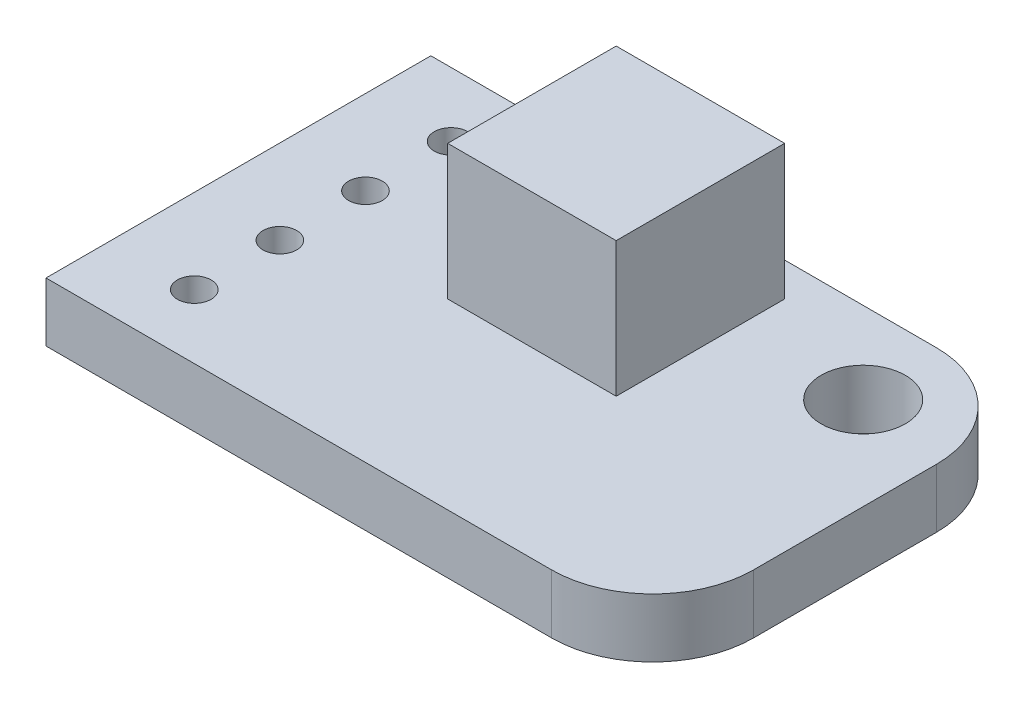
ISO-10303-21;
HEADER;
FILE_DESCRIPTION(('STEP AP214'),'2;1');
FILE_NAME('part.step','',(''),(''),'','','');
FILE_SCHEMA(('AUTOMOTIVE_DESIGN { 1 0 10303 214 1 1 1 1 }'));
ENDSEC;
DATA;
#1=APPLICATION_CONTEXT('core data for automotive mechanical design processes');
#2=APPLICATION_PROTOCOL_DEFINITION('international standard','automotive_design',2000,#1);
#3=PRODUCT_CONTEXT('',#1,'mechanical');
#4=PRODUCT('Part','Part','',(#3));
#5=PRODUCT_RELATED_PRODUCT_CATEGORY('part','',(#4));
#6=PRODUCT_DEFINITION_FORMATION('','',#4);
#7=PRODUCT_DEFINITION_CONTEXT('part definition',#1,'design');
#8=PRODUCT_DEFINITION('design','',#6,#7);
#9=PRODUCT_DEFINITION_SHAPE('','',#8);
#10=(LENGTH_UNIT() NAMED_UNIT(*) SI_UNIT(.MILLI.,.METRE.));
#11=(NAMED_UNIT(*) PLANE_ANGLE_UNIT() SI_UNIT($,.RADIAN.));
#12=(NAMED_UNIT(*) SI_UNIT($,.STERADIAN.) SOLID_ANGLE_UNIT());
#13=UNCERTAINTY_MEASURE_WITH_UNIT(LENGTH_MEASURE(1.E-05),#10,'distance_accuracy_value','');
#14=(GEOMETRIC_REPRESENTATION_CONTEXT(3) GLOBAL_UNCERTAINTY_ASSIGNED_CONTEXT((#13)) GLOBAL_UNIT_ASSIGNED_CONTEXT((#10,
#11,#12)) REPRESENTATION_CONTEXT('',''));
#15=CARTESIAN_POINT('',(0.,0.,0.));
#16=DIRECTION('',(0.,0.,1.));
#17=DIRECTION('',(1.,0.,0.));
#18=AXIS2_PLACEMENT_3D('',#15,#16,#17);
#19=CARTESIAN_POINT('',(7.50000000000001,0.875,2.71));
#20=DIRECTION('',(0.,-1.,0.));
#21=DIRECTION('',(0.,0.,-1.));
#22=AXIS2_PLACEMENT_3D('',#19,#20,#21);
#23=PLANE('',#22);
#24=CARTESIAN_POINT('',(-4.99999999999999,0.875,3.81));
#25=DIRECTION('',(0.,1.,0.));
#26=DIRECTION('',(0.,0.,1.));
#27=AXIS2_PLACEMENT_3D('',#24,#25,#26);
#28=CIRCLE('',#27,0.500000000000001);
#29=CARTESIAN_POINT('',(-4.99999999999999,0.875,4.31));
#30=VERTEX_POINT('',#29);
#31=EDGE_CURVE('E142',#30,#30,#28,.T.);
#32=ORIENTED_EDGE('',*,*,#31,.F.);
#33=EDGE_LOOP('',(#32));
#34=FACE_BOUND('',#33,.T.);
#35=CARTESIAN_POINT('',(-4.99999999999999,0.875,1.27));
#36=DIRECTION('',(0.,1.,0.));
#37=DIRECTION('',(0.,0.,1.));
#38=AXIS2_PLACEMENT_3D('',#35,#36,#37);
#39=CIRCLE('',#38,0.500000000000001);
#40=CARTESIAN_POINT('',(-4.99999999999999,0.875,1.77));
#41=VERTEX_POINT('',#40);
#42=EDGE_CURVE('E151',#41,#41,#39,.T.);
#43=ORIENTED_EDGE('',*,*,#42,.F.);
#44=EDGE_LOOP('',(#43));
#45=FACE_BOUND('',#44,.T.);
#46=CARTESIAN_POINT('',(-4.99999999999999,0.875,-1.27));
#47=DIRECTION('',(0.,1.,0.));
#48=DIRECTION('',(0.,0.,1.));
#49=AXIS2_PLACEMENT_3D('',#46,#47,#48);
#50=CIRCLE('',#49,0.500000000000001);
#51=CARTESIAN_POINT('',(-4.99999999999999,0.875,-0.769999999999999));
#52=VERTEX_POINT('',#51);
#53=EDGE_CURVE('E157',#52,#52,#50,.T.);
#54=ORIENTED_EDGE('',*,*,#53,.F.);
#55=EDGE_LOOP('',(#54));
#56=FACE_BOUND('',#55,.T.);
#57=CARTESIAN_POINT('',(-4.99999999999999,0.875,-3.81));
#58=DIRECTION('',(0.,1.,0.));
#59=DIRECTION('',(0.,0.,1.));
#60=AXIS2_PLACEMENT_3D('',#57,#58,#59);
#61=CIRCLE('',#60,0.500000000000001);
#62=CARTESIAN_POINT('',(-4.99999999999999,0.875,-3.31));
#63=VERTEX_POINT('',#62);
#64=EDGE_CURVE('E163',#63,#63,#61,.T.);
#65=ORIENTED_EDGE('',*,*,#64,.F.);
#66=EDGE_LOOP('',(#65));
#67=FACE_BOUND('',#66,.T.);
#68=CARTESIAN_POINT('',(7.75000000000001,0.875,-3.29));
#69=DIRECTION('',(0.,1.,0.));
#70=DIRECTION('',(0.,0.,1.));
#71=AXIS2_PLACEMENT_3D('',#68,#69,#70);
#72=CIRCLE('',#71,1.25);
#73=CARTESIAN_POINT('',(7.75000000000001,0.875,-2.04));
#74=VERTEX_POINT('',#73);
#75=EDGE_CURVE('E169',#74,#74,#72,.T.);
#76=ORIENTED_EDGE('',*,*,#75,.F.);
#77=EDGE_LOOP('',(#76));
#78=FACE_BOUND('',#77,.T.);
#79=DIRECTION('',(0.,0.,1.));
#80=VECTOR('',#79,1.);
#81=CARTESIAN_POINT('',(-7.49999999999999,0.875,-5.71));
#82=LINE('',#81,#80);
#83=CARTESIAN_POINT('',(-7.49999999999999,0.875,-5.71));
#84=VERTEX_POINT('',#83);
#85=CARTESIAN_POINT('',(-7.49999999999999,0.875,5.71));
#86=VERTEX_POINT('',#85);
#87=EDGE_CURVE('E175',#84,#86,#82,.T.);
#88=ORIENTED_EDGE('',*,*,#87,.T.);
#89=DIRECTION('',(1.,0.,0.));
#90=VECTOR('',#89,1.);
#91=CARTESIAN_POINT('',(-7.49999999999999,0.875,5.71));
#92=LINE('',#91,#90);
#93=CARTESIAN_POINT('',(7.49999999999999,0.875,5.71));
#94=VERTEX_POINT('',#93);
#95=EDGE_CURVE('E178',#86,#94,#92,.T.);
#96=ORIENTED_EDGE('',*,*,#95,.T.);
#97=CARTESIAN_POINT('',(7.50000000000001,0.875,2.71));
#98=DIRECTION('',(0.,1.,0.));
#99=DIRECTION('',(0.,0.,-1.));
#100=AXIS2_PLACEMENT_3D('',#97,#98,#99);
#101=CIRCLE('',#100,3.);
#102=CARTESIAN_POINT('',(10.5,0.875,2.71));
#103=VERTEX_POINT('',#102);
#104=EDGE_CURVE('E181',#94,#103,#101,.T.);
#105=ORIENTED_EDGE('',*,*,#104,.T.);
#106=DIRECTION('',(0.,0.,-1.));
#107=VECTOR('',#106,1.);
#108=CARTESIAN_POINT('',(10.5,0.875,-2.71));
#109=LINE('',#108,#107);
#110=CARTESIAN_POINT('',(10.5,0.875,-2.71));
#111=VERTEX_POINT('',#110);
#112=EDGE_CURVE('E183',#103,#111,#109,.T.);
#113=ORIENTED_EDGE('',*,*,#112,.T.);
#114=CARTESIAN_POINT('',(7.50000000000001,0.875,-2.71));
#115=DIRECTION('',(0.,1.,0.));
#116=DIRECTION('',(0.,0.,-1.));
#117=AXIS2_PLACEMENT_3D('',#114,#115,#116);
#118=CIRCLE('',#117,3.);
#119=CARTESIAN_POINT('',(7.49999999999999,0.875,-5.71));
#120=VERTEX_POINT('',#119);
#121=EDGE_CURVE('E185',#111,#120,#118,.T.);
#122=ORIENTED_EDGE('',*,*,#121,.T.);
#123=DIRECTION('',(-1.,0.,0.));
#124=VECTOR('',#123,1.);
#125=CARTESIAN_POINT('',(-7.49999999999999,0.875,-5.71));
#126=LINE('',#125,#124);
#127=EDGE_CURVE('E187',#120,#84,#126,.T.);
#128=ORIENTED_EDGE('',*,*,#127,.T.);
#129=EDGE_LOOP('',(#88,#96,#105,#113,#122,#128));
#130=FACE_BOUND('',#129,.T.);
#131=DIRECTION('',(0.,0.,1.));
#132=VECTOR('',#131,1.);
#133=CARTESIAN_POINT('',(-0.999999999999989,0.875,-4.71));
#134=LINE('',#133,#132);
#135=CARTESIAN_POINT('',(-0.999999999999989,0.875,-4.71));
#136=VERTEX_POINT('',#135);
#137=CARTESIAN_POINT('',(-0.999999999999988,0.875,0.290000000000001));
#138=VERTEX_POINT('',#137);
#139=EDGE_CURVE('E138',#136,#138,#134,.T.);
#140=ORIENTED_EDGE('',*,*,#139,.F.);
#141=DIRECTION('',(-1.,0.,0.));
#142=VECTOR('',#141,1.);
#143=CARTESIAN_POINT('',(-0.999999999999989,0.875,-4.71));
#144=LINE('',#143,#142);
#145=CARTESIAN_POINT('',(4.00000000000001,0.875,-4.71));
#146=VERTEX_POINT('',#145);
#147=EDGE_CURVE('E135',#146,#136,#144,.T.);
#148=ORIENTED_EDGE('',*,*,#147,.F.);
#149=DIRECTION('',(0.,0.,-1.));
#150=VECTOR('',#149,1.);
#151=CARTESIAN_POINT('',(4.00000000000001,0.875,-4.71));
#152=LINE('',#151,#150);
#153=CARTESIAN_POINT('',(4.00000000000001,0.875,0.29));
#154=VERTEX_POINT('',#153);
#155=EDGE_CURVE('E61',#154,#146,#152,.T.);
#156=ORIENTED_EDGE('',*,*,#155,.F.);
#157=DIRECTION('',(1.,0.,0.));
#158=VECTOR('',#157,1.);
#159=CARTESIAN_POINT('',(-0.999999999999989,0.875,0.290000000000001));
#160=LINE('',#159,#158);
#161=EDGE_CURVE('E56',#138,#154,#160,.T.);
#162=ORIENTED_EDGE('',*,*,#161,.F.);
#163=EDGE_LOOP('',(#140,#148,#156,#162));
#164=FACE_BOUND('',#163,.T.);
#165=ADVANCED_FACE('F41',(#34,#45,#56,#67,#78,#130,#164),#23,.F.);
#166=CARTESIAN_POINT('',(7.50000000000001,-0.875,2.71));
#167=DIRECTION('',(0.,-1.,0.));
#168=DIRECTION('',(0.,0.,-1.));
#169=AXIS2_PLACEMENT_3D('',#166,#167,#168);
#170=PLANE('',#169);
#171=CARTESIAN_POINT('',(-4.99999999999999,-0.875,1.27));
#172=DIRECTION('',(0.,1.,0.));
#173=DIRECTION('',(0.,0.,1.));
#174=AXIS2_PLACEMENT_3D('',#171,#172,#173);
#175=CIRCLE('',#174,0.500000000000001);
#176=CARTESIAN_POINT('',(-4.99999999999999,-0.875,1.77));
#177=VERTEX_POINT('',#176);
#178=EDGE_CURVE('E149',#177,#177,#175,.T.);
#179=ORIENTED_EDGE('',*,*,#178,.T.);
#180=EDGE_LOOP('',(#179));
#181=FACE_BOUND('',#180,.T.);
#182=CARTESIAN_POINT('',(-4.99999999999999,-0.875,-3.81));
#183=DIRECTION('',(0.,1.,0.));
#184=DIRECTION('',(0.,0.,1.));
#185=AXIS2_PLACEMENT_3D('',#182,#183,#184);
#186=CIRCLE('',#185,0.500000000000001);
#187=CARTESIAN_POINT('',(-4.99999999999999,-0.875,-3.31));
#188=VERTEX_POINT('',#187);
#189=EDGE_CURVE('E160',#188,#188,#186,.T.);
#190=ORIENTED_EDGE('',*,*,#189,.T.);
#191=EDGE_LOOP('',(#190));
#192=FACE_BOUND('',#191,.T.);
#193=DIRECTION('',(0.,0.,1.));
#194=VECTOR('',#193,1.);
#195=CARTESIAN_POINT('',(-7.49999999999999,-0.875,-5.71));
#196=LINE('',#195,#194);
#197=CARTESIAN_POINT('',(-7.49999999999999,-0.875,-5.71));
#198=VERTEX_POINT('',#197);
#199=CARTESIAN_POINT('',(-7.49999999999999,-0.875,5.71));
#200=VERTEX_POINT('',#199);
#201=EDGE_CURVE('E172',#198,#200,#196,.T.);
#202=ORIENTED_EDGE('',*,*,#201,.F.);
#203=DIRECTION('',(-1.,0.,0.));
#204=VECTOR('',#203,1.);
#205=CARTESIAN_POINT('',(-7.49999999999999,-0.875,-5.71));
#206=LINE('',#205,#204);
#207=CARTESIAN_POINT('',(7.49999999999999,-0.875,-5.71));
#208=VERTEX_POINT('',#207);
#209=EDGE_CURVE('E179',#208,#198,#206,.T.);
#210=ORIENTED_EDGE('',*,*,#209,.F.);
#211=CARTESIAN_POINT('',(7.50000000000001,-0.875,-2.71));
#212=DIRECTION('',(0.,1.,0.));
#213=DIRECTION('',(0.,0.,-1.));
#214=AXIS2_PLACEMENT_3D('',#211,#212,#213);
#215=CIRCLE('',#214,3.);
#216=CARTESIAN_POINT('',(10.5,-0.875,-2.71));
#217=VERTEX_POINT('',#216);
#218=EDGE_CURVE('E198',#217,#208,#215,.T.);
#219=ORIENTED_EDGE('',*,*,#218,.F.);
#220=DIRECTION('',(0.,0.,-1.));
#221=VECTOR('',#220,1.);
#222=CARTESIAN_POINT('',(10.5,-0.875,-2.71));
#223=LINE('',#222,#221);
#224=CARTESIAN_POINT('',(10.5,-0.875,2.71));
#225=VERTEX_POINT('',#224);
#226=EDGE_CURVE('E196',#225,#217,#223,.T.);
#227=ORIENTED_EDGE('',*,*,#226,.F.);
#228=CARTESIAN_POINT('',(7.50000000000001,-0.875,2.71));
#229=DIRECTION('',(0.,1.,0.));
#230=DIRECTION('',(0.,0.,-1.));
#231=AXIS2_PLACEMENT_3D('',#228,#229,#230);
#232=CIRCLE('',#231,3.);
#233=CARTESIAN_POINT('',(7.49999999999999,-0.875,5.71));
#234=VERTEX_POINT('',#233);
#235=EDGE_CURVE('E194',#234,#225,#232,.T.);
#236=ORIENTED_EDGE('',*,*,#235,.F.);
#237=DIRECTION('',(1.,0.,0.));
#238=VECTOR('',#237,1.);
#239=CARTESIAN_POINT('',(-7.49999999999999,-0.875,5.71));
#240=LINE('',#239,#238);
#241=EDGE_CURVE('E192',#200,#234,#240,.T.);
#242=ORIENTED_EDGE('',*,*,#241,.F.);
#243=EDGE_LOOP('',(#202,#210,#219,#227,#236,#242));
#244=FACE_BOUND('',#243,.T.);
#245=CARTESIAN_POINT('',(7.75000000000001,-0.875,-3.29));
#246=DIRECTION('',(0.,1.,0.));
#247=DIRECTION('',(0.,0.,1.));
#248=AXIS2_PLACEMENT_3D('',#245,#246,#247);
#249=CIRCLE('',#248,1.25);
#250=CARTESIAN_POINT('',(7.75000000000001,-0.875,-2.04));
#251=VERTEX_POINT('',#250);
#252=EDGE_CURVE('E166',#251,#251,#249,.T.);
#253=ORIENTED_EDGE('',*,*,#252,.T.);
#254=EDGE_LOOP('',(#253));
#255=FACE_BOUND('',#254,.T.);
#256=CARTESIAN_POINT('',(-4.99999999999999,-0.875,-1.27));
#257=DIRECTION('',(0.,1.,0.));
#258=DIRECTION('',(0.,0.,1.));
#259=AXIS2_PLACEMENT_3D('',#256,#257,#258);
#260=CIRCLE('',#259,0.500000000000001);
#261=CARTESIAN_POINT('',(-4.99999999999999,-0.875,-0.769999999999999));
#262=VERTEX_POINT('',#261);
#263=EDGE_CURVE('E154',#262,#262,#260,.T.);
#264=ORIENTED_EDGE('',*,*,#263,.T.);
#265=EDGE_LOOP('',(#264));
#266=FACE_BOUND('',#265,.T.);
#267=CARTESIAN_POINT('',(-4.99999999999999,-0.875,3.81));
#268=DIRECTION('',(0.,1.,0.));
#269=DIRECTION('',(0.,0.,1.));
#270=AXIS2_PLACEMENT_3D('',#267,#268,#269);
#271=CIRCLE('',#270,0.500000000000001);
#272=CARTESIAN_POINT('',(-4.99999999999999,-0.875,4.31));
#273=VERTEX_POINT('',#272);
#274=EDGE_CURVE('E139',#273,#273,#271,.T.);
#275=ORIENTED_EDGE('',*,*,#274,.T.);
#276=EDGE_LOOP('',(#275));
#277=FACE_BOUND('',#276,.T.);
#278=ADVANCED_FACE('F222',(#181,#192,#244,#255,#266,#277),#170,.T.);
#279=CARTESIAN_POINT('',(-7.49999999999999,0.875,-5.71));
#280=DIRECTION('',(1.,0.,0.));
#281=DIRECTION('',(0.,0.,-1.));
#282=AXIS2_PLACEMENT_3D('',#279,#280,#281);
#283=PLANE('',#282);
#284=ORIENTED_EDGE('',*,*,#201,.T.);
#285=DIRECTION('',(0.,-1.,0.));
#286=VECTOR('',#285,1.);
#287=CARTESIAN_POINT('',(-7.49999999999999,0.875,5.71));
#288=LINE('',#287,#286);
#289=EDGE_CURVE('E11',#86,#200,#288,.T.);
#290=ORIENTED_EDGE('',*,*,#289,.F.);
#291=ORIENTED_EDGE('',*,*,#87,.F.);
#292=DIRECTION('',(0.,-1.,0.));
#293=VECTOR('',#292,1.);
#294=CARTESIAN_POINT('',(-7.49999999999999,0.875,-5.71));
#295=LINE('',#294,#293);
#296=EDGE_CURVE('E189',#84,#198,#295,.T.);
#297=ORIENTED_EDGE('',*,*,#296,.T.);
#298=EDGE_LOOP('',(#284,#290,#291,#297));
#299=FACE_BOUND('',#298,.T.);
#300=ADVANCED_FACE('F43',(#299),#283,.F.);
#301=CARTESIAN_POINT('',(-7.49999999999999,0.875,5.71));
#302=DIRECTION('',(0.,0.,-1.));
#303=DIRECTION('',(-1.,0.,0.));
#304=AXIS2_PLACEMENT_3D('',#301,#302,#303);
#305=PLANE('',#304);
#306=ORIENTED_EDGE('',*,*,#241,.T.);
#307=DIRECTION('',(0.,-1.,0.));
#308=VECTOR('',#307,1.);
#309=CARTESIAN_POINT('',(7.49999999999999,0.875,5.71));
#310=LINE('',#309,#308);
#311=EDGE_CURVE('E49',#94,#234,#310,.T.);
#312=ORIENTED_EDGE('',*,*,#311,.F.);
#313=ORIENTED_EDGE('',*,*,#95,.F.);
#314=ORIENTED_EDGE('',*,*,#289,.T.);
#315=EDGE_LOOP('',(#306,#312,#313,#314));
#316=FACE_BOUND('',#315,.T.);
#317=ADVANCED_FACE('F239',(#316),#305,.F.);
#318=CARTESIAN_POINT('',(7.50000000000001,0.875,2.71));
#319=DIRECTION('',(0.,-1.,0.));
#320=DIRECTION('',(0.,0.,-1.));
#321=AXIS2_PLACEMENT_3D('',#318,#319,#320);
#322=CYLINDRICAL_SURFACE('',#321,3.);
#323=ORIENTED_EDGE('',*,*,#235,.T.);
#324=DIRECTION('',(0.,-1.,0.));
#325=VECTOR('',#324,1.);
#326=CARTESIAN_POINT('',(10.5,0.875,2.71));
#327=LINE('',#326,#325);
#328=EDGE_CURVE('E209',#103,#225,#327,.T.);
#329=ORIENTED_EDGE('',*,*,#328,.F.);
#330=ORIENTED_EDGE('',*,*,#104,.F.);
#331=ORIENTED_EDGE('',*,*,#311,.T.);
#332=EDGE_LOOP('',(#323,#329,#330,#331));
#333=FACE_BOUND('',#332,.T.);
#334=ADVANCED_FACE('F216',(#333),#322,.T.);
#335=CARTESIAN_POINT('',(10.5,0.875,-2.71));
#336=DIRECTION('',(-1.,0.,0.));
#337=DIRECTION('',(0.,0.,1.));
#338=AXIS2_PLACEMENT_3D('',#335,#336,#337);
#339=PLANE('',#338);
#340=ORIENTED_EDGE('',*,*,#226,.T.);
#341=DIRECTION('',(0.,-1.,0.));
#342=VECTOR('',#341,1.);
#343=CARTESIAN_POINT('',(10.5,0.875,-2.71));
#344=LINE('',#343,#342);
#345=EDGE_CURVE('E206',#111,#217,#344,.T.);
#346=ORIENTED_EDGE('',*,*,#345,.F.);
#347=ORIENTED_EDGE('',*,*,#112,.F.);
#348=ORIENTED_EDGE('',*,*,#328,.T.);
#349=EDGE_LOOP('',(#340,#346,#347,#348));
#350=FACE_BOUND('',#349,.T.);
#351=ADVANCED_FACE('F228',(#350),#339,.F.);
#352=CARTESIAN_POINT('',(7.50000000000001,0.875,-2.71));
#353=DIRECTION('',(0.,-1.,0.));
#354=DIRECTION('',(0.,0.,-1.));
#355=AXIS2_PLACEMENT_3D('',#352,#353,#354);
#356=CYLINDRICAL_SURFACE('',#355,3.);
#357=ORIENTED_EDGE('',*,*,#218,.T.);
#358=DIRECTION('',(0.,-1.,0.));
#359=VECTOR('',#358,1.);
#360=CARTESIAN_POINT('',(7.49999999999999,0.875,-5.71));
#361=LINE('',#360,#359);
#362=EDGE_CURVE('E203',#120,#208,#361,.T.);
#363=ORIENTED_EDGE('',*,*,#362,.F.);
#364=ORIENTED_EDGE('',*,*,#121,.F.);
#365=ORIENTED_EDGE('',*,*,#345,.T.);
#366=EDGE_LOOP('',(#357,#363,#364,#365));
#367=FACE_BOUND('',#366,.T.);
#368=ADVANCED_FACE('F232',(#367),#356,.T.);
#369=CARTESIAN_POINT('',(-7.49999999999999,0.875,-5.71));
#370=DIRECTION('',(0.,0.,1.));
#371=DIRECTION('',(1.,0.,0.));
#372=AXIS2_PLACEMENT_3D('',#369,#370,#371);
#373=PLANE('',#372);
#374=ORIENTED_EDGE('',*,*,#209,.T.);
#375=ORIENTED_EDGE('',*,*,#296,.F.);
#376=ORIENTED_EDGE('',*,*,#127,.F.);
#377=ORIENTED_EDGE('',*,*,#362,.T.);
#378=EDGE_LOOP('',(#374,#375,#376,#377));
#379=FACE_BOUND('',#378,.T.);
#380=ADVANCED_FACE('F242',(#379),#373,.F.);
#381=CARTESIAN_POINT('',(7.75000000000001,0.875,-3.29));
#382=DIRECTION('',(0.,-1.,0.));
#383=DIRECTION('',(0.,0.,-1.));
#384=AXIS2_PLACEMENT_3D('',#381,#382,#383);
#385=CYLINDRICAL_SURFACE('',#384,1.25);
#386=ORIENTED_EDGE('',*,*,#75,.T.);
#387=EDGE_LOOP('',(#386));
#388=FACE_BOUND('',#387,.T.);
#389=ORIENTED_EDGE('',*,*,#252,.F.);
#390=EDGE_LOOP('',(#389));
#391=FACE_BOUND('',#390,.T.);
#392=ADVANCED_FACE('F244',(#388,#391),#385,.F.);
#393=CARTESIAN_POINT('',(-4.99999999999999,0.875,-3.81));
#394=DIRECTION('',(0.,-1.,0.));
#395=DIRECTION('',(0.,0.,-1.));
#396=AXIS2_PLACEMENT_3D('',#393,#394,#395);
#397=CYLINDRICAL_SURFACE('',#396,0.500000000000001);
#398=ORIENTED_EDGE('',*,*,#64,.T.);
#399=EDGE_LOOP('',(#398));
#400=FACE_BOUND('',#399,.T.);
#401=ORIENTED_EDGE('',*,*,#189,.F.);
#402=EDGE_LOOP('',(#401));
#403=FACE_BOUND('',#402,.T.);
#404=ADVANCED_FACE('F250',(#400,#403),#397,.F.);
#405=CARTESIAN_POINT('',(-4.99999999999999,0.875,-1.27));
#406=DIRECTION('',(0.,-1.,0.));
#407=DIRECTION('',(0.,0.,-1.));
#408=AXIS2_PLACEMENT_3D('',#405,#406,#407);
#409=CYLINDRICAL_SURFACE('',#408,0.500000000000001);
#410=ORIENTED_EDGE('',*,*,#53,.T.);
#411=EDGE_LOOP('',(#410));
#412=FACE_BOUND('',#411,.T.);
#413=ORIENTED_EDGE('',*,*,#263,.F.);
#414=EDGE_LOOP('',(#413));
#415=FACE_BOUND('',#414,.T.);
#416=ADVANCED_FACE('F267',(#412,#415),#409,.F.);
#417=CARTESIAN_POINT('',(-4.99999999999999,0.875,1.27));
#418=DIRECTION('',(0.,-1.,0.));
#419=DIRECTION('',(0.,0.,-1.));
#420=AXIS2_PLACEMENT_3D('',#417,#418,#419);
#421=CYLINDRICAL_SURFACE('',#420,0.500000000000001);
#422=ORIENTED_EDGE('',*,*,#42,.T.);
#423=EDGE_LOOP('',(#422));
#424=FACE_BOUND('',#423,.T.);
#425=ORIENTED_EDGE('',*,*,#178,.F.);
#426=EDGE_LOOP('',(#425));
#427=FACE_BOUND('',#426,.T.);
#428=ADVANCED_FACE('F271',(#424,#427),#421,.F.);
#429=CARTESIAN_POINT('',(-4.99999999999999,0.875,3.81));
#430=DIRECTION('',(0.,-1.,0.));
#431=DIRECTION('',(0.,0.,-1.));
#432=AXIS2_PLACEMENT_3D('',#429,#430,#431);
#433=CYLINDRICAL_SURFACE('',#432,0.500000000000001);
#434=ORIENTED_EDGE('',*,*,#31,.T.);
#435=EDGE_LOOP('',(#434));
#436=FACE_BOUND('',#435,.T.);
#437=ORIENTED_EDGE('',*,*,#274,.F.);
#438=EDGE_LOOP('',(#437));
#439=FACE_BOUND('',#438,.T.);
#440=ADVANCED_FACE('F275',(#436,#439),#433,.F.);
#441=CARTESIAN_POINT('',(-0.999999999999989,4.875,-4.71));
#442=DIRECTION('',(1.,0.,0.));
#443=DIRECTION('',(0.,0.,-1.));
#444=AXIS2_PLACEMENT_3D('',#441,#442,#443);
#445=PLANE('',#444);
#446=ORIENTED_EDGE('',*,*,#139,.T.);
#447=DIRECTION('',(0.,-1.,0.));
#448=VECTOR('',#447,1.);
#449=CARTESIAN_POINT('',(-0.999999999999989,4.875,0.290000000000001));
#450=LINE('',#449,#448);
#451=CARTESIAN_POINT('',(-0.999999999999989,4.875,0.290000000000001));
#452=VERTEX_POINT('',#451);
#453=EDGE_CURVE('E119',#452,#138,#450,.T.);
#454=ORIENTED_EDGE('',*,*,#453,.F.);
#455=DIRECTION('',(0.,0.,1.));
#456=VECTOR('',#455,1.);
#457=CARTESIAN_POINT('',(-0.999999999999989,4.875,-4.71));
#458=LINE('',#457,#456);
#459=CARTESIAN_POINT('',(-0.999999999999989,4.875,-4.71));
#460=VERTEX_POINT('',#459);
#461=EDGE_CURVE('E126',#460,#452,#458,.T.);
#462=ORIENTED_EDGE('',*,*,#461,.F.);
#463=DIRECTION('',(0.,-1.,0.));
#464=VECTOR('',#463,1.);
#465=CARTESIAN_POINT('',(-0.999999999999989,4.875,-4.71));
#466=LINE('',#465,#464);
#467=EDGE_CURVE('E441',#460,#136,#466,.T.);
#468=ORIENTED_EDGE('',*,*,#467,.T.);
#469=EDGE_LOOP('',(#446,#454,#462,#468));
#470=FACE_BOUND('',#469,.T.);
#471=ADVANCED_FACE('F137',(#470),#445,.F.);
#472=CARTESIAN_POINT('',(-0.999999999999989,4.875,0.290000000000001));
#473=DIRECTION('',(0.,0.,-1.));
#474=DIRECTION('',(-1.,0.,0.));
#475=AXIS2_PLACEMENT_3D('',#472,#473,#474);
#476=PLANE('',#475);
#477=ORIENTED_EDGE('',*,*,#161,.T.);
#478=DIRECTION('',(0.,-1.,0.));
#479=VECTOR('',#478,1.);
#480=CARTESIAN_POINT('',(4.00000000000001,4.875,0.29));
#481=LINE('',#480,#479);
#482=CARTESIAN_POINT('',(4.00000000000001,4.875,0.29));
#483=VERTEX_POINT('',#482);
#484=EDGE_CURVE('E122',#483,#154,#481,.T.);
#485=ORIENTED_EDGE('',*,*,#484,.F.);
#486=DIRECTION('',(1.,0.,0.));
#487=VECTOR('',#486,1.);
#488=CARTESIAN_POINT('',(-0.999999999999989,4.875,0.290000000000001));
#489=LINE('',#488,#487);
#490=EDGE_CURVE('E115',#452,#483,#489,.T.);
#491=ORIENTED_EDGE('',*,*,#490,.F.);
#492=ORIENTED_EDGE('',*,*,#453,.T.);
#493=EDGE_LOOP('',(#477,#485,#491,#492));
#494=FACE_BOUND('',#493,.T.);
#495=ADVANCED_FACE('F117',(#494),#476,.F.);
#496=CARTESIAN_POINT('',(4.00000000000001,4.875,-4.71));
#497=DIRECTION('',(-1.,0.,0.));
#498=DIRECTION('',(0.,0.,1.));
#499=AXIS2_PLACEMENT_3D('',#496,#497,#498);
#500=PLANE('',#499);
#501=ORIENTED_EDGE('',*,*,#155,.T.);
#502=DIRECTION('',(0.,-1.,0.));
#503=VECTOR('',#502,1.);
#504=CARTESIAN_POINT('',(4.00000000000001,4.875,-4.71));
#505=LINE('',#504,#503);
#506=CARTESIAN_POINT('',(4.00000000000001,4.875,-4.71));
#507=VERTEX_POINT('',#506);
#508=EDGE_CURVE('E144',#507,#146,#505,.T.);
#509=ORIENTED_EDGE('',*,*,#508,.F.);
#510=DIRECTION('',(0.,0.,-1.));
#511=VECTOR('',#510,1.);
#512=CARTESIAN_POINT('',(4.00000000000001,4.875,-4.71));
#513=LINE('',#512,#511);
#514=EDGE_CURVE('E125',#483,#507,#513,.T.);
#515=ORIENTED_EDGE('',*,*,#514,.F.);
#516=ORIENTED_EDGE('',*,*,#484,.T.);
#517=EDGE_LOOP('',(#501,#509,#515,#516));
#518=FACE_BOUND('',#517,.T.);
#519=ADVANCED_FACE('F284',(#518),#500,.F.);
#520=CARTESIAN_POINT('',(-0.999999999999989,4.875,-4.71));
#521=DIRECTION('',(0.,0.,1.));
#522=DIRECTION('',(1.,0.,0.));
#523=AXIS2_PLACEMENT_3D('',#520,#521,#522);
#524=PLANE('',#523);
#525=ORIENTED_EDGE('',*,*,#147,.T.);
#526=ORIENTED_EDGE('',*,*,#467,.F.);
#527=DIRECTION('',(-1.,0.,0.));
#528=VECTOR('',#527,1.);
#529=CARTESIAN_POINT('',(-0.999999999999989,4.875,-4.71));
#530=LINE('',#529,#528);
#531=EDGE_CURVE('E131',#507,#460,#530,.T.);
#532=ORIENTED_EDGE('',*,*,#531,.F.);
#533=ORIENTED_EDGE('',*,*,#508,.T.);
#534=EDGE_LOOP('',(#525,#526,#532,#533));
#535=FACE_BOUND('',#534,.T.);
#536=ADVANCED_FACE('F287',(#535),#524,.F.);
#537=CARTESIAN_POINT('',(0.,4.875,0.));
#538=DIRECTION('',(0.,1.,0.));
#539=DIRECTION('',(0.,0.,1.));
#540=AXIS2_PLACEMENT_3D('',#537,#538,#539);
#541=PLANE('',#540);
#542=ORIENTED_EDGE('',*,*,#461,.T.);
#543=ORIENTED_EDGE('',*,*,#490,.T.);
#544=ORIENTED_EDGE('',*,*,#514,.T.);
#545=ORIENTED_EDGE('',*,*,#531,.T.);
#546=EDGE_LOOP('',(#542,#543,#544,#545));
#547=FACE_BOUND('',#546,.T.);
#548=ADVANCED_FACE('F129',(#547),#541,.T.);
#549=CLOSED_SHELL('',(#165,#278,#300,#317,#334,#351,#368,#380,#392,#404,#416,#428,#440,#471,
#495,#519,#536,#548));
#550=MANIFOLD_SOLID_BREP('B2',#549);
#551=ADVANCED_BREP_SHAPE_REPRESENTATION('',(#18,#550),#14);
#552=SHAPE_DEFINITION_REPRESENTATION(#9,#551);
ENDSEC;
END-ISO-10303-21;
